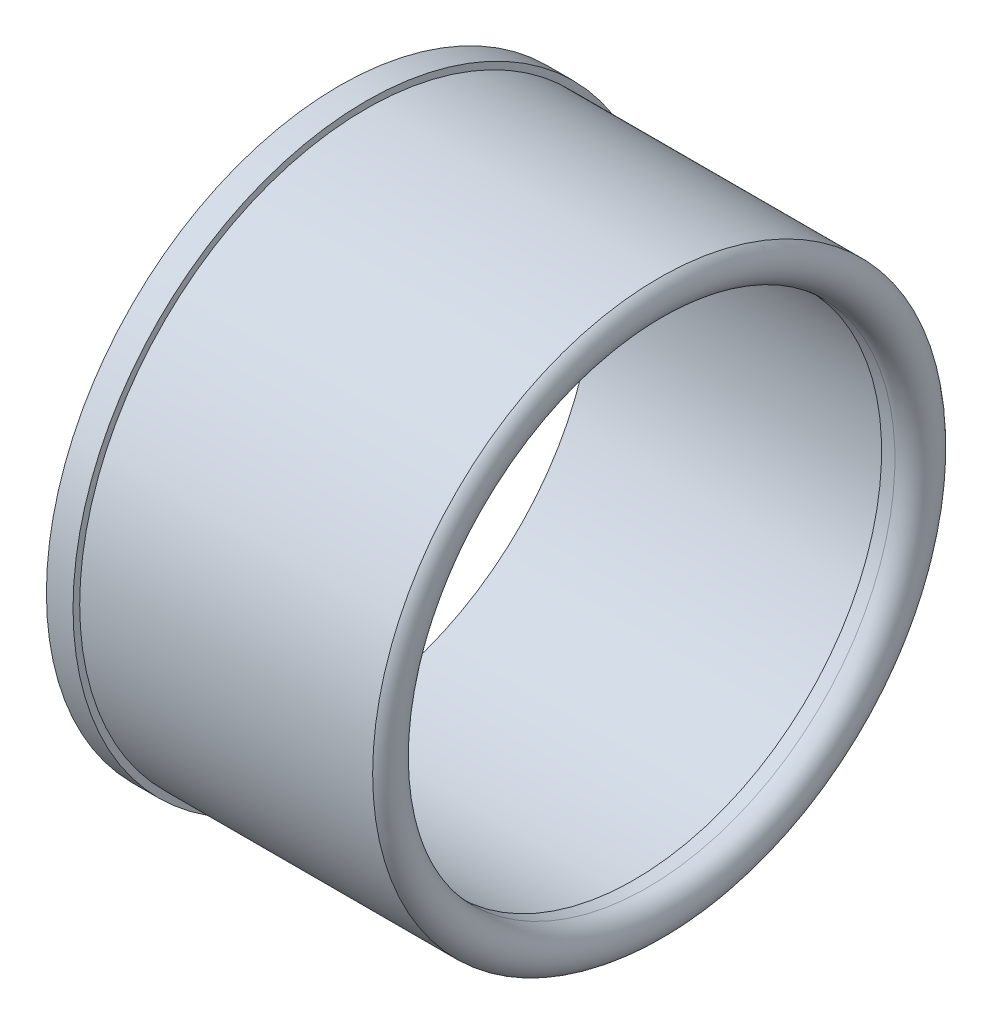
ISO-10303-21;
HEADER;
FILE_DESCRIPTION(('STEP AP214'),'2;1');
FILE_NAME('part.step','',(''),(''),'','','');
FILE_SCHEMA(('AUTOMOTIVE_DESIGN { 1 0 10303 214 1 1 1 1 }'));
ENDSEC;
DATA;
#1=APPLICATION_CONTEXT('core data for automotive mechanical design processes');
#2=APPLICATION_PROTOCOL_DEFINITION('international standard','automotive_design',2000,#1);
#3=PRODUCT_CONTEXT('',#1,'mechanical');
#4=PRODUCT('Part','Part','',(#3));
#5=PRODUCT_RELATED_PRODUCT_CATEGORY('part','',(#4));
#6=PRODUCT_DEFINITION_FORMATION('','',#4);
#7=PRODUCT_DEFINITION_CONTEXT('part definition',#1,'design');
#8=PRODUCT_DEFINITION('design','',#6,#7);
#9=PRODUCT_DEFINITION_SHAPE('','',#8);
#10=(LENGTH_UNIT() NAMED_UNIT(*) SI_UNIT(.MILLI.,.METRE.));
#11=(NAMED_UNIT(*) PLANE_ANGLE_UNIT() SI_UNIT($,.RADIAN.));
#12=(NAMED_UNIT(*) SI_UNIT($,.STERADIAN.) SOLID_ANGLE_UNIT());
#13=UNCERTAINTY_MEASURE_WITH_UNIT(LENGTH_MEASURE(1.E-05),#10,'distance_accuracy_value','');
#14=(GEOMETRIC_REPRESENTATION_CONTEXT(3) GLOBAL_UNCERTAINTY_ASSIGNED_CONTEXT((#13)) GLOBAL_UNIT_ASSIGNED_CONTEXT((#10,
#11,#12)) REPRESENTATION_CONTEXT('',''));
#15=CARTESIAN_POINT('',(0.,0.,0.));
#16=DIRECTION('',(0.,0.,1.));
#17=DIRECTION('',(1.,0.,0.));
#18=AXIS2_PLACEMENT_3D('',#15,#16,#17);
#19=CARTESIAN_POINT('',(12.1757416936097,-8.53326323507829,0.));
#20=DIRECTION('',(-1.,0.,0.));
#21=DIRECTION('',(0.,0.,1.));
#22=AXIS2_PLACEMENT_3D('',#19,#20,#21);
#23=CYLINDRICAL_SURFACE('',#22,9.3);
#24=CARTESIAN_POINT('',(11.9728126653829,-8.53326323507829,0.));
#25=DIRECTION('',(-1.,0.,0.));
#26=DIRECTION('',(0.,0.,1.));
#27=AXIS2_PLACEMENT_3D('',#24,#25,#26);
#28=CIRCLE('',#27,9.3);
#29=CARTESIAN_POINT('',(11.9728126653829,-8.53326323507829,9.3));
#30=VERTEX_POINT('',#29);
#31=EDGE_CURVE('E10',#30,#30,#28,.T.);
#32=ORIENTED_EDGE('',*,*,#31,.T.);
#33=EDGE_LOOP('',(#32));
#34=FACE_BOUND('',#33,.T.);
#35=CARTESIAN_POINT('',(12.4728126653829,-8.53326323507829,0.));
#36=DIRECTION('',(-1.,0.,0.));
#37=DIRECTION('',(0.,0.,1.));
#38=AXIS2_PLACEMENT_3D('',#35,#36,#37);
#39=CIRCLE('',#38,9.3);
#40=CARTESIAN_POINT('',(12.4728126653829,-8.53326323507829,9.3));
#41=VERTEX_POINT('',#40);
#42=EDGE_CURVE('E61',#41,#41,#39,.T.);
#43=ORIENTED_EDGE('',*,*,#42,.F.);
#44=EDGE_LOOP('',(#43));
#45=FACE_BOUND('',#44,.T.);
#46=ADVANCED_FACE('F33',(#34,#45),#23,.F.);
#47=CARTESIAN_POINT('',(11.9728126653829,0.766736764921708,0.));
#48=DIRECTION('',(-1.,0.,0.));
#49=DIRECTION('',(0.,0.,1.));
#50=AXIS2_PLACEMENT_3D('',#47,#48,#49);
#51=PLANE('',#50);
#52=CARTESIAN_POINT('',(11.9728126653829,-8.53326323507829,0.));
#53=DIRECTION('',(-1.,0.,0.));
#54=DIRECTION('',(0.,0.,1.));
#55=AXIS2_PLACEMENT_3D('',#52,#53,#54);
#56=CIRCLE('',#55,9.55);
#57=CARTESIAN_POINT('',(11.9728126653829,-8.53326323507829,9.55));
#58=VERTEX_POINT('',#57);
#59=EDGE_CURVE('E39',#58,#58,#56,.T.);
#60=ORIENTED_EDGE('',*,*,#59,.T.);
#61=EDGE_LOOP('',(#60));
#62=FACE_BOUND('',#61,.T.);
#63=ORIENTED_EDGE('',*,*,#31,.F.);
#64=EDGE_LOOP('',(#63));
#65=FACE_BOUND('',#64,.T.);
#66=ADVANCED_FACE('F69',(#62,#65),#51,.T.);
#67=CARTESIAN_POINT('',(12.1757416936097,-8.53326323507829,0.));
#68=DIRECTION('',(-1.,0.,0.));
#69=DIRECTION('',(0.,0.,1.));
#70=AXIS2_PLACEMENT_3D('',#67,#68,#69);
#71=CYLINDRICAL_SURFACE('',#70,9.55);
#72=CARTESIAN_POINT('',(0.912123334161097,-8.53326323507829,0.));
#73=DIRECTION('',(-1.,0.,0.));
#74=DIRECTION('',(0.,0.,1.));
#75=AXIS2_PLACEMENT_3D('',#72,#73,#74);
#76=CIRCLE('',#75,9.55);
#77=CARTESIAN_POINT('',(0.912123334161097,-8.53326323507829,9.55));
#78=VERTEX_POINT('',#77);
#79=EDGE_CURVE('E43',#78,#78,#76,.T.);
#80=ORIENTED_EDGE('',*,*,#79,.T.);
#81=EDGE_LOOP('',(#80));
#82=FACE_BOUND('',#81,.T.);
#83=ORIENTED_EDGE('',*,*,#59,.F.);
#84=EDGE_LOOP('',(#83));
#85=FACE_BOUND('',#84,.T.);
#86=ADVANCED_FACE('F73',(#82,#85),#71,.F.);
#87=CARTESIAN_POINT('',(0.912123334161096,1.01673676492171,0.));
#88=DIRECTION('',(-1.,0.,0.));
#89=DIRECTION('',(0.,0.,1.));
#90=AXIS2_PLACEMENT_3D('',#87,#88,#89);
#91=PLANE('',#90);
#92=CARTESIAN_POINT('',(0.912123334161097,-8.53326323507829,0.));
#93=DIRECTION('',(-1.,0.,0.));
#94=DIRECTION('',(0.,0.,1.));
#95=AXIS2_PLACEMENT_3D('',#92,#93,#94);
#96=CIRCLE('',#95,11.);
#97=CARTESIAN_POINT('',(0.912123334161097,-8.53326323507829,11.));
#98=VERTEX_POINT('',#97);
#99=EDGE_CURVE('E47',#98,#98,#96,.T.);
#100=ORIENTED_EDGE('',*,*,#99,.T.);
#101=EDGE_LOOP('',(#100));
#102=FACE_BOUND('',#101,.T.);
#103=ORIENTED_EDGE('',*,*,#79,.F.);
#104=EDGE_LOOP('',(#103));
#105=FACE_BOUND('',#104,.T.);
#106=ADVANCED_FACE('F77',(#102,#105),#91,.T.);
#107=CARTESIAN_POINT('',(12.1757416936097,-8.53326323507829,0.));
#108=DIRECTION('',(-1.,0.,0.));
#109=DIRECTION('',(0.,0.,1.));
#110=AXIS2_PLACEMENT_3D('',#107,#108,#109);
#111=CYLINDRICAL_SURFACE('',#110,11.);
#112=CARTESIAN_POINT('',(1.9121233341611,-8.53326323507829,0.));
#113=DIRECTION('',(-1.,0.,0.));
#114=DIRECTION('',(0.,0.,1.));
#115=AXIS2_PLACEMENT_3D('',#112,#113,#114);
#116=CIRCLE('',#115,11.);
#117=CARTESIAN_POINT('',(1.9121233341611,-8.53326323507829,11.));
#118=VERTEX_POINT('',#117);
#119=EDGE_CURVE('E52',#118,#118,#116,.T.);
#120=ORIENTED_EDGE('',*,*,#119,.T.);
#121=EDGE_LOOP('',(#120));
#122=FACE_BOUND('',#121,.T.);
#123=ORIENTED_EDGE('',*,*,#99,.F.);
#124=EDGE_LOOP('',(#123));
#125=FACE_BOUND('',#124,.T.);
#126=ADVANCED_FACE('F84',(#122,#125),#111,.T.);
#127=CARTESIAN_POINT('',(1.9121233341611,2.46673676492171,0.));
#128=DIRECTION('',(1.,0.,0.));
#129=DIRECTION('',(0.,0.,-1.));
#130=AXIS2_PLACEMENT_3D('',#127,#128,#129);
#131=PLANE('',#130);
#132=CARTESIAN_POINT('',(1.9121233341611,-8.53326323507829,0.));
#133=DIRECTION('',(-1.,0.,0.));
#134=DIRECTION('',(0.,0.,1.));
#135=AXIS2_PLACEMENT_3D('',#132,#133,#134);
#136=CIRCLE('',#135,10.75);
#137=CARTESIAN_POINT('',(1.9121233341611,-8.53326323507829,10.75));
#138=VERTEX_POINT('',#137);
#139=EDGE_CURVE('E55',#138,#138,#136,.T.);
#140=ORIENTED_EDGE('',*,*,#139,.T.);
#141=EDGE_LOOP('',(#140));
#142=FACE_BOUND('',#141,.T.);
#143=ORIENTED_EDGE('',*,*,#119,.F.);
#144=EDGE_LOOP('',(#143));
#145=FACE_BOUND('',#144,.T.);
#146=ADVANCED_FACE('F88',(#142,#145),#131,.T.);
#147=CARTESIAN_POINT('',(12.1757416936097,-8.53326323507829,0.));
#148=DIRECTION('',(-1.,0.,0.));
#149=DIRECTION('',(0.,0.,1.));
#150=AXIS2_PLACEMENT_3D('',#147,#148,#149);
#151=CYLINDRICAL_SURFACE('',#150,10.75);
#152=CARTESIAN_POINT('',(12.9121233341611,-8.53326323507829,0.));
#153=DIRECTION('',(-1.,0.,0.));
#154=DIRECTION('',(0.,0.,1.));
#155=AXIS2_PLACEMENT_3D('',#152,#153,#154);
#156=CIRCLE('',#155,10.75);
#157=CARTESIAN_POINT('',(12.9121233341611,-8.53326323507829,10.75));
#158=VERTEX_POINT('',#157);
#159=EDGE_CURVE('E58',#158,#158,#156,.T.);
#160=ORIENTED_EDGE('',*,*,#159,.T.);
#161=EDGE_LOOP('',(#160));
#162=FACE_BOUND('',#161,.T.);
#163=ORIENTED_EDGE('',*,*,#139,.F.);
#164=EDGE_LOOP('',(#163));
#165=FACE_BOUND('',#164,.T.);
#166=ADVANCED_FACE('F92',(#162,#165),#151,.T.);
#167=CARTESIAN_POINT('',(12.4728126653829,-8.53326323507829,0.));
#168=DIRECTION('',(-1.,0.,0.));
#169=DIRECTION('',(0.,0.,1.));
#170=AXIS2_PLACEMENT_3D('',#167,#168,#169);
#171=TOROIDAL_SURFACE('',#170,10.0915496081732,0.791549608173223);
#172=ORIENTED_EDGE('',*,*,#42,.T.);
#173=EDGE_LOOP('',(#172));
#174=FACE_BOUND('',#173,.T.);
#175=ORIENTED_EDGE('',*,*,#159,.F.);
#176=EDGE_LOOP('',(#175));
#177=FACE_BOUND('',#176,.T.);
#178=ADVANCED_FACE('F65',(#174,#177),#171,.T.);
#179=CLOSED_SHELL('',(#46,#66,#86,#106,#126,#146,#166,#178));
#180=MANIFOLD_SOLID_BREP('B2',#179);
#181=ADVANCED_BREP_SHAPE_REPRESENTATION('',(#18,#180),#14);
#182=SHAPE_DEFINITION_REPRESENTATION(#9,#181);
ENDSEC;
END-ISO-10303-21;
